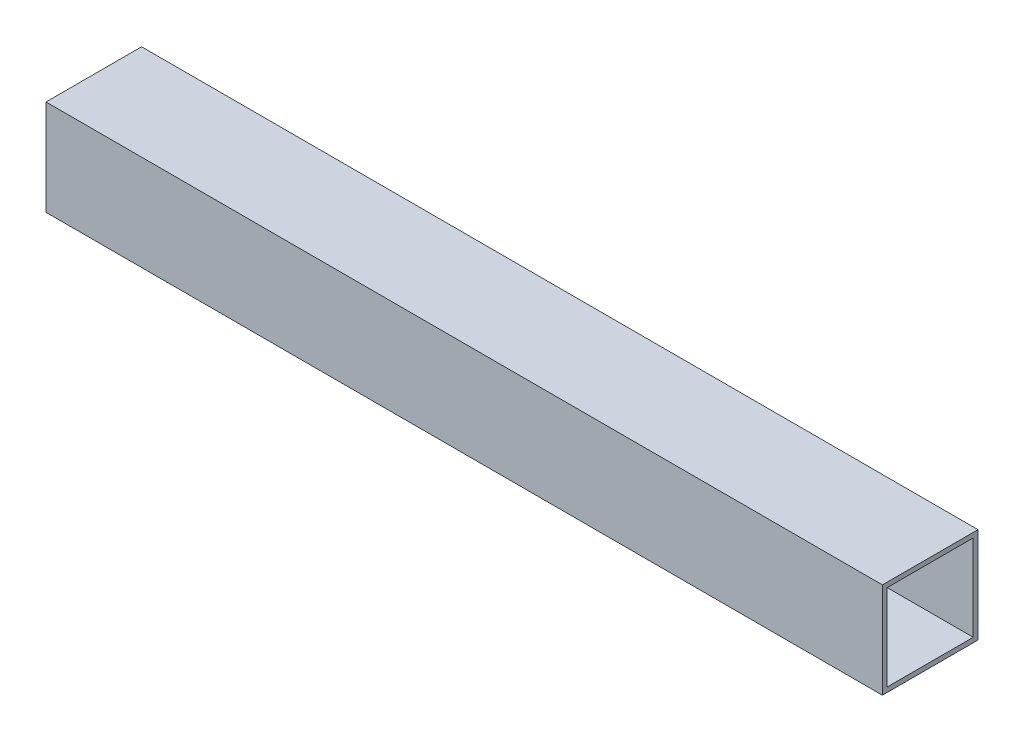
ISO-10303-21;
HEADER;
FILE_DESCRIPTION(('STEP AP214'),'2;1');
FILE_NAME('part.step','',(''),(''),'','','');
FILE_SCHEMA(('AUTOMOTIVE_DESIGN { 1 0 10303 214 1 1 1 1 }'));
ENDSEC;
DATA;
#1=APPLICATION_CONTEXT('core data for automotive mechanical design processes');
#2=APPLICATION_PROTOCOL_DEFINITION('international standard','automotive_design',2000,#1);
#3=PRODUCT_CONTEXT('',#1,'mechanical');
#4=PRODUCT('Part','Part','',(#3));
#5=PRODUCT_RELATED_PRODUCT_CATEGORY('part','',(#4));
#6=PRODUCT_DEFINITION_FORMATION('','',#4);
#7=PRODUCT_DEFINITION_CONTEXT('part definition',#1,'design');
#8=PRODUCT_DEFINITION('design','',#6,#7);
#9=PRODUCT_DEFINITION_SHAPE('','',#8);
#10=(LENGTH_UNIT() NAMED_UNIT(*) SI_UNIT(.MILLI.,.METRE.));
#11=(NAMED_UNIT(*) PLANE_ANGLE_UNIT() SI_UNIT($,.RADIAN.));
#12=(NAMED_UNIT(*) SI_UNIT($,.STERADIAN.) SOLID_ANGLE_UNIT());
#13=UNCERTAINTY_MEASURE_WITH_UNIT(LENGTH_MEASURE(1.E-05),#10,'distance_accuracy_value','');
#14=(GEOMETRIC_REPRESENTATION_CONTEXT(3) GLOBAL_UNCERTAINTY_ASSIGNED_CONTEXT((#13)) GLOBAL_UNIT_ASSIGNED_CONTEXT((#10,
#11,#12)) REPRESENTATION_CONTEXT('',''));
#15=CARTESIAN_POINT('',(0.,0.,0.));
#16=DIRECTION('',(0.,0.,1.));
#17=DIRECTION('',(1.,0.,0.));
#18=AXIS2_PLACEMENT_3D('',#15,#16,#17);
#19=CARTESIAN_POINT('',(360.,20.,20.));
#20=DIRECTION('',(0.,0.,-1.));
#21=DIRECTION('',(0.,1.,0.));
#22=AXIS2_PLACEMENT_3D('',#19,#20,#21);
#23=PLANE('',#22);
#24=DIRECTION('',(0.,-1.,0.));
#25=VECTOR('',#24,1.);
#26=CARTESIAN_POINT('',(-10.,-20.,20.));
#27=LINE('',#26,#25);
#28=CARTESIAN_POINT('',(-10.,20.,20.));
#29=VERTEX_POINT('',#28);
#30=CARTESIAN_POINT('',(-10.,-20.,20.));
#31=VERTEX_POINT('',#30);
#32=EDGE_CURVE('E190',#29,#31,#27,.T.);
#33=ORIENTED_EDGE('',*,*,#32,.F.);
#34=DIRECTION('',(-1.,0.,0.));
#35=VECTOR('',#34,1.);
#36=CARTESIAN_POINT('',(360.,20.,20.));
#37=LINE('',#36,#35);
#38=CARTESIAN_POINT('',(-360.,20.,20.));
#39=VERTEX_POINT('',#38);
#40=EDGE_CURVE('E131',#29,#39,#37,.T.);
#41=ORIENTED_EDGE('',*,*,#40,.T.);
#42=DIRECTION('',(0.,-1.,0.));
#43=VECTOR('',#42,1.);
#44=CARTESIAN_POINT('',(-360.,20.,20.));
#45=LINE('',#44,#43);
#46=CARTESIAN_POINT('',(-360.,-20.,20.));
#47=VERTEX_POINT('',#46);
#48=EDGE_CURVE('E113',#39,#47,#45,.T.);
#49=ORIENTED_EDGE('',*,*,#48,.T.);
#50=DIRECTION('',(-1.,0.,0.));
#51=VECTOR('',#50,1.);
#52=CARTESIAN_POINT('',(360.,-20.,20.));
#53=LINE('',#52,#51);
#54=EDGE_CURVE('E11',#31,#47,#53,.T.);
#55=ORIENTED_EDGE('',*,*,#54,.F.);
#56=EDGE_LOOP('',(#33,#41,#49,#55));
#57=FACE_BOUND('',#56,.T.);
#58=ADVANCED_FACE('F32',(#57),#23,.F.);
#59=CARTESIAN_POINT('',(360.,-20.,-20.));
#60=DIRECTION('',(0.,1.,0.));
#61=DIRECTION('',(0.,0.,1.));
#62=AXIS2_PLACEMENT_3D('',#59,#60,#61);
#63=PLANE('',#62);
#64=DIRECTION('',(0.,0.,-1.));
#65=VECTOR('',#64,1.);
#66=CARTESIAN_POINT('',(-10.,-20.,20.));
#67=LINE('',#66,#65);
#68=CARTESIAN_POINT('',(-10.,-20.,-20.));
#69=VERTEX_POINT('',#68);
#70=EDGE_CURVE('E157',#31,#69,#67,.T.);
#71=ORIENTED_EDGE('',*,*,#70,.F.);
#72=ORIENTED_EDGE('',*,*,#54,.T.);
#73=DIRECTION('',(0.,0.,-1.));
#74=VECTOR('',#73,1.);
#75=CARTESIAN_POINT('',(-360.,-20.,-20.));
#76=LINE('',#75,#74);
#77=CARTESIAN_POINT('',(-360.,-20.,-20.));
#78=VERTEX_POINT('',#77);
#79=EDGE_CURVE('E117',#47,#78,#76,.T.);
#80=ORIENTED_EDGE('',*,*,#79,.T.);
#81=DIRECTION('',(-1.,0.,0.));
#82=VECTOR('',#81,1.);
#83=CARTESIAN_POINT('',(360.,-20.,-20.));
#84=LINE('',#83,#82);
#85=EDGE_CURVE('E39',#69,#78,#84,.T.);
#86=ORIENTED_EDGE('',*,*,#85,.F.);
#87=EDGE_LOOP('',(#71,#72,#80,#86));
#88=FACE_BOUND('',#87,.T.);
#89=ADVANCED_FACE('F143',(#88),#63,.F.);
#90=CARTESIAN_POINT('',(360.,20.,-20.));
#91=DIRECTION('',(0.,0.,1.));
#92=DIRECTION('',(0.,-1.,0.));
#93=AXIS2_PLACEMENT_3D('',#90,#91,#92);
#94=PLANE('',#93);
#95=DIRECTION('',(0.,1.,0.));
#96=VECTOR('',#95,1.);
#97=CARTESIAN_POINT('',(-10.,-20.,-20.));
#98=LINE('',#97,#96);
#99=CARTESIAN_POINT('',(-9.9999999999999,20.,-20.));
#100=VERTEX_POINT('',#99);
#101=EDGE_CURVE('E46',#69,#100,#98,.T.);
#102=ORIENTED_EDGE('',*,*,#101,.F.);
#103=ORIENTED_EDGE('',*,*,#85,.T.);
#104=DIRECTION('',(0.,1.,0.));
#105=VECTOR('',#104,1.);
#106=CARTESIAN_POINT('',(-360.,20.,-20.));
#107=LINE('',#106,#105);
#108=CARTESIAN_POINT('',(-360.,20.,-20.));
#109=VERTEX_POINT('',#108);
#110=EDGE_CURVE('E125',#78,#109,#107,.T.);
#111=ORIENTED_EDGE('',*,*,#110,.T.);
#112=DIRECTION('',(-1.,0.,0.));
#113=VECTOR('',#112,1.);
#114=CARTESIAN_POINT('',(360.,20.,-20.));
#115=LINE('',#114,#113);
#116=EDGE_CURVE('E133',#100,#109,#115,.T.);
#117=ORIENTED_EDGE('',*,*,#116,.F.);
#118=EDGE_LOOP('',(#102,#103,#111,#117));
#119=FACE_BOUND('',#118,.T.);
#120=ADVANCED_FACE('F136',(#119),#94,.F.);
#121=CARTESIAN_POINT('',(360.,20.,-20.));
#122=DIRECTION('',(0.,-1.,0.));
#123=DIRECTION('',(0.,0.,-1.));
#124=AXIS2_PLACEMENT_3D('',#121,#122,#123);
#125=PLANE('',#124);
#126=DIRECTION('',(0.,0.,1.));
#127=VECTOR('',#126,1.);
#128=CARTESIAN_POINT('',(-10.,20.,20.));
#129=LINE('',#128,#127);
#130=EDGE_CURVE('E152',#100,#29,#129,.T.);
#131=ORIENTED_EDGE('',*,*,#130,.F.);
#132=ORIENTED_EDGE('',*,*,#116,.T.);
#133=DIRECTION('',(0.,0.,1.));
#134=VECTOR('',#133,1.);
#135=CARTESIAN_POINT('',(-360.,20.,-20.));
#136=LINE('',#135,#134);
#137=EDGE_CURVE('E128',#109,#39,#136,.T.);
#138=ORIENTED_EDGE('',*,*,#137,.T.);
#139=ORIENTED_EDGE('',*,*,#40,.F.);
#140=EDGE_LOOP('',(#131,#132,#138,#139));
#141=FACE_BOUND('',#140,.T.);
#142=ADVANCED_FACE('F151',(#141),#125,.F.);
#143=CARTESIAN_POINT('',(360.,18.,-18.));
#144=DIRECTION('',(0.,0.,1.));
#145=DIRECTION('',(0.,-1.,0.));
#146=AXIS2_PLACEMENT_3D('',#143,#144,#145);
#147=PLANE('',#146);
#148=DIRECTION('',(-1.,0.,0.));
#149=VECTOR('',#148,1.);
#150=CARTESIAN_POINT('',(360.,-18.,-18.));
#151=LINE('',#150,#149);
#152=CARTESIAN_POINT('',(-9.9999999999999,-18.,-18.));
#153=VERTEX_POINT('',#152);
#154=CARTESIAN_POINT('',(-360.,-18.,-18.));
#155=VERTEX_POINT('',#154);
#156=EDGE_CURVE('E107',#153,#155,#151,.T.);
#157=ORIENTED_EDGE('',*,*,#156,.F.);
#158=DIRECTION('',(0.,1.,0.));
#159=VECTOR('',#158,1.);
#160=CARTESIAN_POINT('',(-10.,-20.,-18.));
#161=LINE('',#160,#159);
#162=CARTESIAN_POINT('',(-10.,18.,-18.));
#163=VERTEX_POINT('',#162);
#164=EDGE_CURVE('E54',#153,#163,#161,.T.);
#165=ORIENTED_EDGE('',*,*,#164,.T.);
#166=DIRECTION('',(-1.,0.,0.));
#167=VECTOR('',#166,1.);
#168=CARTESIAN_POINT('',(360.,18.,-18.));
#169=LINE('',#168,#167);
#170=CARTESIAN_POINT('',(-360.,18.,-18.));
#171=VERTEX_POINT('',#170);
#172=EDGE_CURVE('E105',#163,#171,#169,.T.);
#173=ORIENTED_EDGE('',*,*,#172,.T.);
#174=DIRECTION('',(0.,1.,0.));
#175=VECTOR('',#174,1.);
#176=CARTESIAN_POINT('',(-360.,18.,-18.));
#177=LINE('',#176,#175);
#178=EDGE_CURVE('E154',#155,#171,#177,.T.);
#179=ORIENTED_EDGE('',*,*,#178,.F.);
#180=EDGE_LOOP('',(#157,#165,#173,#179));
#181=FACE_BOUND('',#180,.T.);
#182=ADVANCED_FACE('F103',(#181),#147,.T.);
#183=CARTESIAN_POINT('',(360.,18.,-18.));
#184=DIRECTION('',(0.,-1.,0.));
#185=DIRECTION('',(0.,0.,-1.));
#186=AXIS2_PLACEMENT_3D('',#183,#184,#185);
#187=PLANE('',#186);
#188=ORIENTED_EDGE('',*,*,#172,.F.);
#189=DIRECTION('',(0.,0.,1.));
#190=VECTOR('',#189,1.);
#191=CARTESIAN_POINT('',(-10.,18.,20.));
#192=LINE('',#191,#190);
#193=CARTESIAN_POINT('',(-10.,18.,18.));
#194=VERTEX_POINT('',#193);
#195=EDGE_CURVE('E93',#163,#194,#192,.T.);
#196=ORIENTED_EDGE('',*,*,#195,.T.);
#197=DIRECTION('',(-1.,0.,0.));
#198=VECTOR('',#197,1.);
#199=CARTESIAN_POINT('',(360.,18.,18.));
#200=LINE('',#199,#198);
#201=CARTESIAN_POINT('',(-360.,18.,18.));
#202=VERTEX_POINT('',#201);
#203=EDGE_CURVE('E114',#194,#202,#200,.T.);
#204=ORIENTED_EDGE('',*,*,#203,.T.);
#205=DIRECTION('',(0.,0.,1.));
#206=VECTOR('',#205,1.);
#207=CARTESIAN_POINT('',(-360.,18.,-18.));
#208=LINE('',#207,#206);
#209=EDGE_CURVE('E111',#171,#202,#208,.T.);
#210=ORIENTED_EDGE('',*,*,#209,.F.);
#211=EDGE_LOOP('',(#188,#196,#204,#210));
#212=FACE_BOUND('',#211,.T.);
#213=ADVANCED_FACE('F109',(#212),#187,.T.);
#214=CARTESIAN_POINT('',(360.,18.,18.));
#215=DIRECTION('',(0.,0.,-1.));
#216=DIRECTION('',(0.,1.,0.));
#217=AXIS2_PLACEMENT_3D('',#214,#215,#216);
#218=PLANE('',#217);
#219=ORIENTED_EDGE('',*,*,#203,.F.);
#220=DIRECTION('',(0.,-1.,0.));
#221=VECTOR('',#220,1.);
#222=CARTESIAN_POINT('',(-10.,-20.,18.));
#223=LINE('',#222,#221);
#224=CARTESIAN_POINT('',(-10.,-18.,18.));
#225=VERTEX_POINT('',#224);
#226=EDGE_CURVE('E96',#194,#225,#223,.T.);
#227=ORIENTED_EDGE('',*,*,#226,.T.);
#228=DIRECTION('',(-1.,0.,0.));
#229=VECTOR('',#228,1.);
#230=CARTESIAN_POINT('',(360.,-18.,18.));
#231=LINE('',#230,#229);
#232=CARTESIAN_POINT('',(-360.,-18.,18.));
#233=VERTEX_POINT('',#232);
#234=EDGE_CURVE('E119',#225,#233,#231,.T.);
#235=ORIENTED_EDGE('',*,*,#234,.T.);
#236=DIRECTION('',(0.,-1.,0.));
#237=VECTOR('',#236,1.);
#238=CARTESIAN_POINT('',(-360.,18.,18.));
#239=LINE('',#238,#237);
#240=EDGE_CURVE('E162',#202,#233,#239,.T.);
#241=ORIENTED_EDGE('',*,*,#240,.F.);
#242=EDGE_LOOP('',(#219,#227,#235,#241));
#243=FACE_BOUND('',#242,.T.);
#244=ADVANCED_FACE('F172',(#243),#218,.T.);
#245=CARTESIAN_POINT('',(360.,-18.,-18.));
#246=DIRECTION('',(0.,1.,0.));
#247=DIRECTION('',(0.,0.,1.));
#248=AXIS2_PLACEMENT_3D('',#245,#246,#247);
#249=PLANE('',#248);
#250=ORIENTED_EDGE('',*,*,#234,.F.);
#251=DIRECTION('',(0.,0.,-1.));
#252=VECTOR('',#251,1.);
#253=CARTESIAN_POINT('',(-10.,-18.,20.));
#254=LINE('',#253,#252);
#255=EDGE_CURVE('E191',#225,#153,#254,.T.);
#256=ORIENTED_EDGE('',*,*,#255,.T.);
#257=ORIENTED_EDGE('',*,*,#156,.T.);
#258=DIRECTION('',(0.,0.,-1.));
#259=VECTOR('',#258,1.);
#260=CARTESIAN_POINT('',(-360.,-18.,-18.));
#261=LINE('',#260,#259);
#262=EDGE_CURVE('E165',#233,#155,#261,.T.);
#263=ORIENTED_EDGE('',*,*,#262,.F.);
#264=EDGE_LOOP('',(#250,#256,#257,#263));
#265=FACE_BOUND('',#264,.T.);
#266=ADVANCED_FACE('F174',(#265),#249,.T.);
#267=CARTESIAN_POINT('',(-360.,-20.,20.));
#268=DIRECTION('',(-1.,0.,0.));
#269=DIRECTION('',(0.,0.,1.));
#270=AXIS2_PLACEMENT_3D('',#267,#268,#269);
#271=PLANE('',#270);
#272=ORIENTED_EDGE('',*,*,#48,.F.);
#273=ORIENTED_EDGE('',*,*,#137,.F.);
#274=ORIENTED_EDGE('',*,*,#110,.F.);
#275=ORIENTED_EDGE('',*,*,#79,.F.);
#276=EDGE_LOOP('',(#272,#273,#274,#275));
#277=FACE_BOUND('',#276,.T.);
#278=ORIENTED_EDGE('',*,*,#262,.T.);
#279=ORIENTED_EDGE('',*,*,#178,.T.);
#280=ORIENTED_EDGE('',*,*,#209,.T.);
#281=ORIENTED_EDGE('',*,*,#240,.T.);
#282=EDGE_LOOP('',(#278,#279,#280,#281));
#283=FACE_BOUND('',#282,.T.);
#284=ADVANCED_FACE('F147',(#277,#283),#271,.T.);
#285=CARTESIAN_POINT('',(-10.,-20.,20.));
#286=DIRECTION('',(1.,0.,0.));
#287=DIRECTION('',(0.,0.,-1.));
#288=AXIS2_PLACEMENT_3D('',#285,#286,#287);
#289=PLANE('',#288);
#290=ORIENTED_EDGE('',*,*,#255,.F.);
#291=ORIENTED_EDGE('',*,*,#226,.F.);
#292=ORIENTED_EDGE('',*,*,#195,.F.);
#293=ORIENTED_EDGE('',*,*,#164,.F.);
#294=EDGE_LOOP('',(#290,#291,#292,#293));
#295=FACE_BOUND('',#294,.T.);
#296=ORIENTED_EDGE('',*,*,#32,.T.);
#297=ORIENTED_EDGE('',*,*,#70,.T.);
#298=ORIENTED_EDGE('',*,*,#101,.T.);
#299=ORIENTED_EDGE('',*,*,#130,.T.);
#300=EDGE_LOOP('',(#296,#297,#298,#299));
#301=FACE_BOUND('',#300,.T.);
#302=ADVANCED_FACE('F94',(#295,#301),#289,.T.);
#303=CLOSED_SHELL('',(#58,#89,#120,#142,#182,#213,#244,#266,#284,#302));
#304=MANIFOLD_SOLID_BREP('B2',#303);
#305=ADVANCED_BREP_SHAPE_REPRESENTATION('',(#18,#304),#14);
#306=SHAPE_DEFINITION_REPRESENTATION(#9,#305);
ENDSEC;
END-ISO-10303-21;
